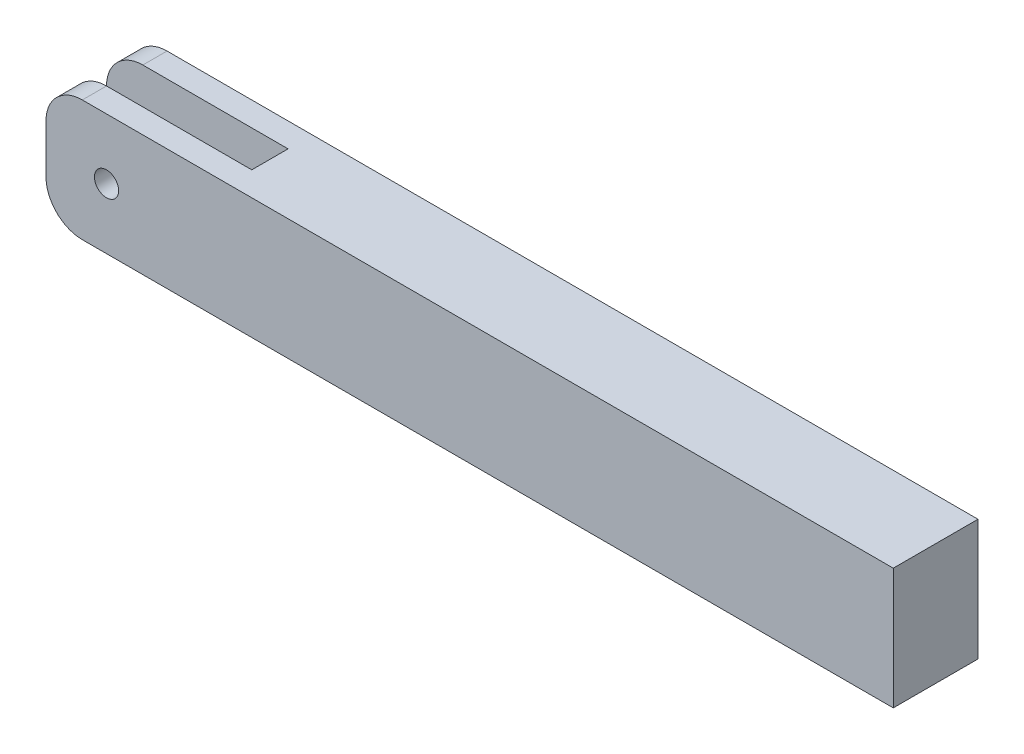
ISO-10303-21;
HEADER;
FILE_DESCRIPTION(('STEP AP214'),'2;1');
FILE_NAME('part.step','',(''),(''),'','','');
FILE_SCHEMA(('AUTOMOTIVE_DESIGN { 1 0 10303 214 1 1 1 1 }'));
ENDSEC;
DATA;
#1=APPLICATION_CONTEXT('core data for automotive mechanical design processes');
#2=APPLICATION_PROTOCOL_DEFINITION('international standard','automotive_design',2000,#1);
#3=PRODUCT_CONTEXT('',#1,'mechanical');
#4=PRODUCT('Part','Part','',(#3));
#5=PRODUCT_RELATED_PRODUCT_CATEGORY('part','',(#4));
#6=PRODUCT_DEFINITION_FORMATION('','',#4);
#7=PRODUCT_DEFINITION_CONTEXT('part definition',#1,'design');
#8=PRODUCT_DEFINITION('design','',#6,#7);
#9=PRODUCT_DEFINITION_SHAPE('','',#8);
#10=(LENGTH_UNIT() NAMED_UNIT(*) SI_UNIT(.MILLI.,.METRE.));
#11=(NAMED_UNIT(*) PLANE_ANGLE_UNIT() SI_UNIT($,.RADIAN.));
#12=(NAMED_UNIT(*) SI_UNIT($,.STERADIAN.) SOLID_ANGLE_UNIT());
#13=UNCERTAINTY_MEASURE_WITH_UNIT(LENGTH_MEASURE(1.E-05),#10,'distance_accuracy_value','');
#14=(GEOMETRIC_REPRESENTATION_CONTEXT(3) GLOBAL_UNCERTAINTY_ASSIGNED_CONTEXT((#13)) GLOBAL_UNIT_ASSIGNED_CONTEXT((#10,
#11,#12)) REPRESENTATION_CONTEXT('',''));
#15=CARTESIAN_POINT('',(0.,0.,0.));
#16=DIRECTION('',(0.,0.,1.));
#17=DIRECTION('',(1.,0.,0.));
#18=AXIS2_PLACEMENT_3D('',#15,#16,#17);
#19=CARTESIAN_POINT('',(-10.,10.,17.5));
#20=DIRECTION('',(0.,0.,-1.));
#21=DIRECTION('',(-1.,0.,0.));
#22=AXIS2_PLACEMENT_3D('',#19,#20,#21);
#23=CYLINDRICAL_SURFACE('',#22,15.);
#24=DIRECTION('',(0.,0.,-1.));
#25=VECTOR('',#24,1.);
#26=CARTESIAN_POINT('',(-25.,10.,17.5));
#27=LINE('',#26,#25);
#28=CARTESIAN_POINT('',(-25.,10.,-7.5));
#29=VERTEX_POINT('',#28);
#30=CARTESIAN_POINT('',(-25.,10.,-17.5));
#31=VERTEX_POINT('',#30);
#32=EDGE_CURVE('E129',#29,#31,#27,.T.);
#33=ORIENTED_EDGE('',*,*,#32,.F.);
#34=CARTESIAN_POINT('',(-10.,10.,-7.5));
#35=DIRECTION('',(0.,0.,-1.));
#36=DIRECTION('',(-1.,0.,0.));
#37=AXIS2_PLACEMENT_3D('',#34,#35,#36);
#38=CIRCLE('',#37,15.);
#39=CARTESIAN_POINT('',(-10.,25.,-7.5));
#40=VERTEX_POINT('',#39);
#41=EDGE_CURVE('E144',#29,#40,#38,.T.);
#42=ORIENTED_EDGE('',*,*,#41,.T.);
#43=DIRECTION('',(0.,0.,-1.));
#44=VECTOR('',#43,1.);
#45=CARTESIAN_POINT('',(-10.,25.,17.5));
#46=LINE('',#45,#44);
#47=CARTESIAN_POINT('',(-10.,25.,-17.5));
#48=VERTEX_POINT('',#47);
#49=EDGE_CURVE('E163',#40,#48,#46,.T.);
#50=ORIENTED_EDGE('',*,*,#49,.T.);
#51=CARTESIAN_POINT('',(-10.,10.,-17.5));
#52=DIRECTION('',(0.,0.,1.));
#53=DIRECTION('',(1.,0.,0.));
#54=AXIS2_PLACEMENT_3D('',#51,#52,#53);
#55=CIRCLE('',#54,15.);
#56=EDGE_CURVE('E147',#48,#31,#55,.T.);
#57=ORIENTED_EDGE('',*,*,#56,.T.);
#58=EDGE_LOOP('',(#33,#42,#50,#57));
#59=FACE_BOUND('',#58,.T.);
#60=ADVANCED_FACE('F39',(#59),#23,.T.);
#61=CARTESIAN_POINT('',(-25.,10.,17.5));
#62=DIRECTION('',(1.,0.,0.));
#63=DIRECTION('',(0.,1.,0.));
#64=AXIS2_PLACEMENT_3D('',#61,#62,#63);
#65=PLANE('',#64);
#66=DIRECTION('',(0.,0.,-1.));
#67=VECTOR('',#66,1.);
#68=CARTESIAN_POINT('',(-25.,-10.,17.5));
#69=LINE('',#68,#67);
#70=CARTESIAN_POINT('',(-25.,-10.,-7.5));
#71=VERTEX_POINT('',#70);
#72=CARTESIAN_POINT('',(-25.,-10.,-17.5));
#73=VERTEX_POINT('',#72);
#74=EDGE_CURVE('E130',#71,#73,#69,.T.);
#75=ORIENTED_EDGE('',*,*,#74,.F.);
#76=DIRECTION('',(0.,1.,0.));
#77=VECTOR('',#76,1.);
#78=CARTESIAN_POINT('',(-25.,-25.,-7.5));
#79=LINE('',#78,#77);
#80=EDGE_CURVE('E202',#71,#29,#79,.T.);
#81=ORIENTED_EDGE('',*,*,#80,.T.);
#82=ORIENTED_EDGE('',*,*,#32,.T.);
#83=DIRECTION('',(0.,-1.,0.));
#84=VECTOR('',#83,1.);
#85=CARTESIAN_POINT('',(-25.,10.,-17.5));
#86=LINE('',#85,#84);
#87=EDGE_CURVE('E150',#31,#73,#86,.T.);
#88=ORIENTED_EDGE('',*,*,#87,.T.);
#89=EDGE_LOOP('',(#75,#81,#82,#88));
#90=FACE_BOUND('',#89,.T.);
#91=ADVANCED_FACE('F209',(#90),#65,.F.);
#92=CARTESIAN_POINT('',(-10.,-10.,17.5));
#93=DIRECTION('',(0.,0.,-1.));
#94=DIRECTION('',(-1.,0.,0.));
#95=AXIS2_PLACEMENT_3D('',#92,#93,#94);
#96=CYLINDRICAL_SURFACE('',#95,15.);
#97=DIRECTION('',(0.,0.,-1.));
#98=VECTOR('',#97,1.);
#99=CARTESIAN_POINT('',(-10.,-25.,17.5));
#100=LINE('',#99,#98);
#101=CARTESIAN_POINT('',(-10.,-25.,-7.5));
#102=VERTEX_POINT('',#101);
#103=CARTESIAN_POINT('',(-10.,-25.,-17.5));
#104=VERTEX_POINT('',#103);
#105=EDGE_CURVE('E159',#102,#104,#100,.T.);
#106=ORIENTED_EDGE('',*,*,#105,.F.);
#107=CARTESIAN_POINT('',(-10.,-10.,-7.5));
#108=DIRECTION('',(0.,0.,-1.));
#109=DIRECTION('',(-1.,0.,0.));
#110=AXIS2_PLACEMENT_3D('',#107,#108,#109);
#111=CIRCLE('',#110,15.);
#112=EDGE_CURVE('E205',#102,#71,#111,.T.);
#113=ORIENTED_EDGE('',*,*,#112,.T.);
#114=ORIENTED_EDGE('',*,*,#74,.T.);
#115=CARTESIAN_POINT('',(-10.,-10.,-17.5));
#116=DIRECTION('',(0.,0.,1.));
#117=DIRECTION('',(-1.,0.,0.));
#118=AXIS2_PLACEMENT_3D('',#115,#116,#117);
#119=CIRCLE('',#118,15.);
#120=EDGE_CURVE('E153',#73,#104,#119,.T.);
#121=ORIENTED_EDGE('',*,*,#120,.T.);
#122=EDGE_LOOP('',(#106,#113,#114,#121));
#123=FACE_BOUND('',#122,.T.);
#124=ADVANCED_FACE('F288',(#123),#96,.T.);
#125=CARTESIAN_POINT('',(325.,25.,17.5));
#126=DIRECTION('',(-1.,0.,0.));
#127=DIRECTION('',(0.,0.,1.));
#128=AXIS2_PLACEMENT_3D('',#125,#126,#127);
#129=PLANE('',#128);
#130=DIRECTION('',(0.,1.,0.));
#131=VECTOR('',#130,1.);
#132=CARTESIAN_POINT('',(325.,25.,-17.5));
#133=LINE('',#132,#131);
#134=CARTESIAN_POINT('',(325.,-25.,-17.5));
#135=VERTEX_POINT('',#134);
#136=CARTESIAN_POINT('',(325.,25.,-17.5));
#137=VERTEX_POINT('',#136);
#138=EDGE_CURVE('E140',#135,#137,#133,.T.);
#139=ORIENTED_EDGE('',*,*,#138,.T.);
#140=DIRECTION('',(0.,0.,-1.));
#141=VECTOR('',#140,1.);
#142=CARTESIAN_POINT('',(325.,25.,17.5));
#143=LINE('',#142,#141);
#144=CARTESIAN_POINT('',(325.,25.,17.5));
#145=VERTEX_POINT('',#144);
#146=EDGE_CURVE('E48',#145,#137,#143,.T.);
#147=ORIENTED_EDGE('',*,*,#146,.F.);
#148=DIRECTION('',(0.,1.,0.));
#149=VECTOR('',#148,1.);
#150=CARTESIAN_POINT('',(325.,25.,17.5));
#151=LINE('',#150,#149);
#152=CARTESIAN_POINT('',(325.,-25.,17.5));
#153=VERTEX_POINT('',#152);
#154=EDGE_CURVE('E157',#153,#145,#151,.T.);
#155=ORIENTED_EDGE('',*,*,#154,.F.);
#156=DIRECTION('',(0.,0.,-1.));
#157=VECTOR('',#156,1.);
#158=CARTESIAN_POINT('',(325.,-25.,17.5));
#159=LINE('',#158,#157);
#160=EDGE_CURVE('E136',#153,#135,#159,.T.);
#161=ORIENTED_EDGE('',*,*,#160,.T.);
#162=EDGE_LOOP('',(#139,#147,#155,#161));
#163=FACE_BOUND('',#162,.T.);
#164=ADVANCED_FACE('F41',(#163),#129,.F.);
#165=CARTESIAN_POINT('',(-10.,25.,17.5));
#166=DIRECTION('',(0.,-1.,0.));
#167=DIRECTION('',(1.,0.,0.));
#168=AXIS2_PLACEMENT_3D('',#165,#166,#167);
#169=PLANE('',#168);
#170=ORIENTED_EDGE('',*,*,#49,.F.);
#171=DIRECTION('',(-1.,0.,0.));
#172=VECTOR('',#171,1.);
#173=CARTESIAN_POINT('',(-25.,25.,-7.5));
#174=LINE('',#173,#172);
#175=CARTESIAN_POINT('',(50.,25.,-7.49999999999999));
#176=VERTEX_POINT('',#175);
#177=EDGE_CURVE('E187',#176,#40,#174,.T.);
#178=ORIENTED_EDGE('',*,*,#177,.F.);
#179=DIRECTION('',(0.,0.,-1.));
#180=VECTOR('',#179,1.);
#181=CARTESIAN_POINT('',(50.,25.,-7.49999999999999));
#182=LINE('',#181,#180);
#183=CARTESIAN_POINT('',(50.,25.,7.49999999999999));
#184=VERTEX_POINT('',#183);
#185=EDGE_CURVE('E246',#184,#176,#182,.T.);
#186=ORIENTED_EDGE('',*,*,#185,.F.);
#187=DIRECTION('',(1.,0.,0.));
#188=VECTOR('',#187,1.);
#189=CARTESIAN_POINT('',(-25.,25.,7.5));
#190=LINE('',#189,#188);
#191=CARTESIAN_POINT('',(-10.,25.,7.5));
#192=VERTEX_POINT('',#191);
#193=EDGE_CURVE('E230',#192,#184,#190,.T.);
#194=ORIENTED_EDGE('',*,*,#193,.F.);
#195=CARTESIAN_POINT('',(-10.,25.,17.5));
#196=VERTEX_POINT('',#195);
#197=EDGE_CURVE('E164',#196,#192,#46,.T.);
#198=ORIENTED_EDGE('',*,*,#197,.F.);
#199=DIRECTION('',(-1.,0.,0.));
#200=VECTOR('',#199,1.);
#201=CARTESIAN_POINT('',(-10.,25.,17.5));
#202=LINE('',#201,#200);
#203=EDGE_CURVE('E99',#145,#196,#202,.T.);
#204=ORIENTED_EDGE('',*,*,#203,.F.);
#205=ORIENTED_EDGE('',*,*,#146,.T.);
#206=DIRECTION('',(-1.,0.,0.));
#207=VECTOR('',#206,1.);
#208=CARTESIAN_POINT('',(-10.,25.,-17.5));
#209=LINE('',#208,#207);
#210=EDGE_CURVE('E143',#137,#48,#209,.T.);
#211=ORIENTED_EDGE('',*,*,#210,.T.);
#212=EDGE_LOOP('',(#170,#178,#186,#194,#198,#204,#205,#211));
#213=FACE_BOUND('',#212,.T.);
#214=ADVANCED_FACE('F169',(#213),#169,.F.);
#215=ORIENTED_EDGE('',*,*,#197,.T.);
#216=CARTESIAN_POINT('',(-10.,10.,7.5));
#217=DIRECTION('',(0.,0.,1.));
#218=DIRECTION('',(1.,0.,0.));
#219=AXIS2_PLACEMENT_3D('',#216,#217,#218);
#220=CIRCLE('',#219,15.);
#221=CARTESIAN_POINT('',(-25.,10.,7.5));
#222=VERTEX_POINT('',#221);
#223=EDGE_CURVE('E213',#192,#222,#220,.T.);
#224=ORIENTED_EDGE('',*,*,#223,.T.);
#225=CARTESIAN_POINT('',(-25.,10.,17.5));
#226=VERTEX_POINT('',#225);
#227=EDGE_CURVE('E161',#226,#222,#27,.T.);
#228=ORIENTED_EDGE('',*,*,#227,.F.);
#229=CARTESIAN_POINT('',(-10.,10.,17.5));
#230=DIRECTION('',(0.,0.,1.));
#231=DIRECTION('',(1.,0.,0.));
#232=AXIS2_PLACEMENT_3D('',#229,#230,#231);
#233=CIRCLE('',#232,15.);
#234=EDGE_CURVE('E115',#196,#226,#233,.T.);
#235=ORIENTED_EDGE('',*,*,#234,.F.);
#236=EDGE_LOOP('',(#215,#224,#228,#235));
#237=FACE_BOUND('',#236,.T.);
#238=ADVANCED_FACE('F232',(#237),#23,.T.);
#239=ORIENTED_EDGE('',*,*,#227,.T.);
#240=DIRECTION('',(0.,1.,0.));
#241=VECTOR('',#240,1.);
#242=CARTESIAN_POINT('',(-25.,-25.,7.5));
#243=LINE('',#242,#241);
#244=CARTESIAN_POINT('',(-25.,-10.,7.5));
#245=VERTEX_POINT('',#244);
#246=EDGE_CURVE('E126',#245,#222,#243,.T.);
#247=ORIENTED_EDGE('',*,*,#246,.F.);
#248=CARTESIAN_POINT('',(-25.,-10.,17.5));
#249=VERTEX_POINT('',#248);
#250=EDGE_CURVE('E122',#249,#245,#69,.T.);
#251=ORIENTED_EDGE('',*,*,#250,.F.);
#252=DIRECTION('',(0.,-1.,0.));
#253=VECTOR('',#252,1.);
#254=CARTESIAN_POINT('',(-25.,10.,17.5));
#255=LINE('',#254,#253);
#256=EDGE_CURVE('E108',#226,#249,#255,.T.);
#257=ORIENTED_EDGE('',*,*,#256,.F.);
#258=EDGE_LOOP('',(#239,#247,#251,#257));
#259=FACE_BOUND('',#258,.T.);
#260=ADVANCED_FACE('F123',(#259),#65,.F.);
#261=ORIENTED_EDGE('',*,*,#250,.T.);
#262=CARTESIAN_POINT('',(-10.,-10.,7.5));
#263=DIRECTION('',(0.,0.,1.));
#264=DIRECTION('',(1.,0.,0.));
#265=AXIS2_PLACEMENT_3D('',#262,#263,#264);
#266=CIRCLE('',#265,15.);
#267=CARTESIAN_POINT('',(-10.,-25.,7.5));
#268=VERTEX_POINT('',#267);
#269=EDGE_CURVE('E210',#245,#268,#266,.T.);
#270=ORIENTED_EDGE('',*,*,#269,.T.);
#271=CARTESIAN_POINT('',(-10.,-25.,17.5));
#272=VERTEX_POINT('',#271);
#273=EDGE_CURVE('E134',#272,#268,#100,.T.);
#274=ORIENTED_EDGE('',*,*,#273,.F.);
#275=CARTESIAN_POINT('',(-10.,-10.,17.5));
#276=DIRECTION('',(0.,0.,1.));
#277=DIRECTION('',(-1.,0.,0.));
#278=AXIS2_PLACEMENT_3D('',#275,#276,#277);
#279=CIRCLE('',#278,15.);
#280=EDGE_CURVE('E112',#249,#272,#279,.T.);
#281=ORIENTED_EDGE('',*,*,#280,.F.);
#282=EDGE_LOOP('',(#261,#270,#274,#281));
#283=FACE_BOUND('',#282,.T.);
#284=ADVANCED_FACE('F132',(#283),#96,.T.);
#285=CARTESIAN_POINT('',(-10.,-25.,17.5));
#286=DIRECTION('',(0.,1.,0.));
#287=DIRECTION('',(-1.,0.,0.));
#288=AXIS2_PLACEMENT_3D('',#285,#286,#287);
#289=PLANE('',#288);
#290=DIRECTION('',(0.,0.,-1.));
#291=VECTOR('',#290,1.);
#292=CARTESIAN_POINT('',(50.,-25.,-7.49999999999999));
#293=LINE('',#292,#291);
#294=CARTESIAN_POINT('',(50.,-25.,7.49999999999999));
#295=VERTEX_POINT('',#294);
#296=CARTESIAN_POINT('',(50.,-25.,-7.49999999999999));
#297=VERTEX_POINT('',#296);
#298=EDGE_CURVE('E55',#295,#297,#293,.T.);
#299=ORIENTED_EDGE('',*,*,#298,.T.);
#300=DIRECTION('',(-1.,0.,0.));
#301=VECTOR('',#300,1.);
#302=CARTESIAN_POINT('',(-25.,-25.,-7.5));
#303=LINE('',#302,#301);
#304=EDGE_CURVE('E221',#297,#102,#303,.T.);
#305=ORIENTED_EDGE('',*,*,#304,.T.);
#306=ORIENTED_EDGE('',*,*,#105,.T.);
#307=DIRECTION('',(1.,0.,0.));
#308=VECTOR('',#307,1.);
#309=CARTESIAN_POINT('',(-10.,-25.,-17.5));
#310=LINE('',#309,#308);
#311=EDGE_CURVE('E90',#104,#135,#310,.T.);
#312=ORIENTED_EDGE('',*,*,#311,.T.);
#313=ORIENTED_EDGE('',*,*,#160,.F.);
#314=DIRECTION('',(1.,0.,0.));
#315=VECTOR('',#314,1.);
#316=CARTESIAN_POINT('',(-10.,-25.,17.5));
#317=LINE('',#316,#315);
#318=EDGE_CURVE('E64',#272,#153,#317,.T.);
#319=ORIENTED_EDGE('',*,*,#318,.F.);
#320=ORIENTED_EDGE('',*,*,#273,.T.);
#321=DIRECTION('',(1.,0.,0.));
#322=VECTOR('',#321,1.);
#323=CARTESIAN_POINT('',(-10.,-25.,7.5));
#324=LINE('',#323,#322);
#325=EDGE_CURVE('E12',#268,#295,#324,.T.);
#326=ORIENTED_EDGE('',*,*,#325,.T.);
#327=EDGE_LOOP('',(#299,#305,#306,#312,#313,#319,#320,#326));
#328=FACE_BOUND('',#327,.T.);
#329=ADVANCED_FACE('F250',(#328),#289,.F.);
#330=CARTESIAN_POINT('',(-10.,-10.,17.5));
#331=DIRECTION('',(0.,0.,-1.));
#332=DIRECTION('',(-1.,0.,0.));
#333=AXIS2_PLACEMENT_3D('',#330,#331,#332);
#334=PLANE('',#333);
#335=CARTESIAN_POINT('',(0.,0.,17.5));
#336=DIRECTION('',(0.,0.,1.));
#337=DIRECTION('',(1.,0.,0.));
#338=AXIS2_PLACEMENT_3D('',#335,#336,#337);
#339=CIRCLE('',#338,5.);
#340=CARTESIAN_POINT('',(5.,0.,17.5));
#341=VERTEX_POINT('',#340);
#342=EDGE_CURVE('E264',#341,#341,#339,.T.);
#343=ORIENTED_EDGE('',*,*,#342,.F.);
#344=EDGE_LOOP('',(#343));
#345=FACE_BOUND('',#344,.T.);
#346=ORIENTED_EDGE('',*,*,#154,.T.);
#347=ORIENTED_EDGE('',*,*,#203,.T.);
#348=ORIENTED_EDGE('',*,*,#234,.T.);
#349=ORIENTED_EDGE('',*,*,#256,.T.);
#350=ORIENTED_EDGE('',*,*,#280,.T.);
#351=ORIENTED_EDGE('',*,*,#318,.T.);
#352=EDGE_LOOP('',(#346,#347,#348,#349,#350,#351));
#353=FACE_BOUND('',#352,.T.);
#354=ADVANCED_FACE('F110',(#345,#353),#334,.F.);
#355=CARTESIAN_POINT('',(-10.,-10.,-17.5));
#356=DIRECTION('',(0.,0.,-1.));
#357=DIRECTION('',(-1.,0.,0.));
#358=AXIS2_PLACEMENT_3D('',#355,#356,#357);
#359=PLANE('',#358);
#360=CARTESIAN_POINT('',(0.,0.,-17.5));
#361=DIRECTION('',(0.,0.,1.));
#362=DIRECTION('',(1.,0.,0.));
#363=AXIS2_PLACEMENT_3D('',#360,#361,#362);
#364=CIRCLE('',#363,5.);
#365=CARTESIAN_POINT('',(5.,0.,-17.5));
#366=VERTEX_POINT('',#365);
#367=EDGE_CURVE('E260',#366,#366,#364,.T.);
#368=ORIENTED_EDGE('',*,*,#367,.T.);
#369=EDGE_LOOP('',(#368));
#370=FACE_BOUND('',#369,.T.);
#371=ORIENTED_EDGE('',*,*,#138,.F.);
#372=ORIENTED_EDGE('',*,*,#311,.F.);
#373=ORIENTED_EDGE('',*,*,#120,.F.);
#374=ORIENTED_EDGE('',*,*,#87,.F.);
#375=ORIENTED_EDGE('',*,*,#56,.F.);
#376=ORIENTED_EDGE('',*,*,#210,.F.);
#377=EDGE_LOOP('',(#371,#372,#373,#374,#375,#376));
#378=FACE_BOUND('',#377,.T.);
#379=ADVANCED_FACE('F175',(#370,#378),#359,.T.);
#380=CARTESIAN_POINT('',(-25.,-25.,-7.5));
#381=DIRECTION('',(0.,0.,-1.));
#382=DIRECTION('',(-1.,0.,0.));
#383=AXIS2_PLACEMENT_3D('',#380,#381,#382);
#384=PLANE('',#383);
#385=CARTESIAN_POINT('',(0.,0.,-7.5));
#386=DIRECTION('',(0.,0.,-1.));
#387=DIRECTION('',(-1.,0.,0.));
#388=AXIS2_PLACEMENT_3D('',#385,#386,#387);
#389=CIRCLE('',#388,5.);
#390=CARTESIAN_POINT('',(-5.,0.,-7.5));
#391=VERTEX_POINT('',#390);
#392=EDGE_CURVE('E253',#391,#391,#389,.T.);
#393=ORIENTED_EDGE('',*,*,#392,.T.);
#394=EDGE_LOOP('',(#393));
#395=FACE_BOUND('',#394,.T.);
#396=ORIENTED_EDGE('',*,*,#80,.F.);
#397=ORIENTED_EDGE('',*,*,#112,.F.);
#398=ORIENTED_EDGE('',*,*,#304,.F.);
#399=DIRECTION('',(0.,1.,0.));
#400=VECTOR('',#399,1.);
#401=CARTESIAN_POINT('',(50.,-25.,-7.49999999999999));
#402=LINE('',#401,#400);
#403=EDGE_CURVE('E211',#297,#176,#402,.T.);
#404=ORIENTED_EDGE('',*,*,#403,.T.);
#405=ORIENTED_EDGE('',*,*,#177,.T.);
#406=ORIENTED_EDGE('',*,*,#41,.F.);
#407=EDGE_LOOP('',(#396,#397,#398,#404,#405,#406));
#408=FACE_BOUND('',#407,.T.);
#409=ADVANCED_FACE('F204',(#395,#408),#384,.F.);
#410=CARTESIAN_POINT('',(-25.,-25.,7.5));
#411=DIRECTION('',(0.,0.,1.));
#412=DIRECTION('',(1.,0.,0.));
#413=AXIS2_PLACEMENT_3D('',#410,#411,#412);
#414=PLANE('',#413);
#415=CARTESIAN_POINT('',(0.,0.,7.5));
#416=DIRECTION('',(0.,0.,1.));
#417=DIRECTION('',(1.,0.,0.));
#418=AXIS2_PLACEMENT_3D('',#415,#416,#417);
#419=CIRCLE('',#418,5.);
#420=CARTESIAN_POINT('',(5.,0.,7.5));
#421=VERTEX_POINT('',#420);
#422=EDGE_CURVE('E43',#421,#421,#419,.T.);
#423=ORIENTED_EDGE('',*,*,#422,.T.);
#424=EDGE_LOOP('',(#423));
#425=FACE_BOUND('',#424,.T.);
#426=ORIENTED_EDGE('',*,*,#193,.T.);
#427=DIRECTION('',(0.,1.,0.));
#428=VECTOR('',#427,1.);
#429=CARTESIAN_POINT('',(50.,-25.,7.49999999999999));
#430=LINE('',#429,#428);
#431=EDGE_CURVE('E215',#295,#184,#430,.T.);
#432=ORIENTED_EDGE('',*,*,#431,.F.);
#433=ORIENTED_EDGE('',*,*,#325,.F.);
#434=ORIENTED_EDGE('',*,*,#269,.F.);
#435=ORIENTED_EDGE('',*,*,#246,.T.);
#436=ORIENTED_EDGE('',*,*,#223,.F.);
#437=EDGE_LOOP('',(#426,#432,#433,#434,#435,#436));
#438=FACE_BOUND('',#437,.T.);
#439=ADVANCED_FACE('F324',(#425,#438),#414,.F.);
#440=CARTESIAN_POINT('',(50.,-25.,-7.49999999999999));
#441=DIRECTION('',(1.,0.,0.));
#442=DIRECTION('',(0.,0.,-1.));
#443=AXIS2_PLACEMENT_3D('',#440,#441,#442);
#444=PLANE('',#443);
#445=ORIENTED_EDGE('',*,*,#185,.T.);
#446=ORIENTED_EDGE('',*,*,#403,.F.);
#447=ORIENTED_EDGE('',*,*,#298,.F.);
#448=ORIENTED_EDGE('',*,*,#431,.T.);
#449=EDGE_LOOP('',(#445,#446,#447,#448));
#450=FACE_BOUND('',#449,.T.);
#451=ADVANCED_FACE('F245',(#450),#444,.F.);
#452=CARTESIAN_POINT('',(0.,0.,-17.5));
#453=DIRECTION('',(0.,0.,1.));
#454=DIRECTION('',(1.,0.,0.));
#455=AXIS2_PLACEMENT_3D('',#452,#453,#454);
#456=CYLINDRICAL_SURFACE('',#455,5.);
#457=ORIENTED_EDGE('',*,*,#342,.T.);
#458=EDGE_LOOP('',(#457));
#459=FACE_BOUND('',#458,.T.);
#460=ORIENTED_EDGE('',*,*,#422,.F.);
#461=EDGE_LOOP('',(#460));
#462=FACE_BOUND('',#461,.T.);
#463=ADVANCED_FACE('F271',(#459,#462),#456,.F.);
#464=ORIENTED_EDGE('',*,*,#367,.F.);
#465=EDGE_LOOP('',(#464));
#466=FACE_BOUND('',#465,.T.);
#467=ORIENTED_EDGE('',*,*,#392,.F.);
#468=EDGE_LOOP('',(#467));
#469=FACE_BOUND('',#468,.T.);
#470=ADVANCED_FACE('F365',(#466,#469),#456,.F.);
#471=CLOSED_SHELL('',(#60,#91,#124,#164,#214,#238,#260,#284,#329,#354,#379,#409,#439,#451,#463,#470));
#472=MANIFOLD_SOLID_BREP('B2',#471);
#473=ADVANCED_BREP_SHAPE_REPRESENTATION('',(#18,#472),#14);
#474=SHAPE_DEFINITION_REPRESENTATION(#9,#473);
ENDSEC;
END-ISO-10303-21;
